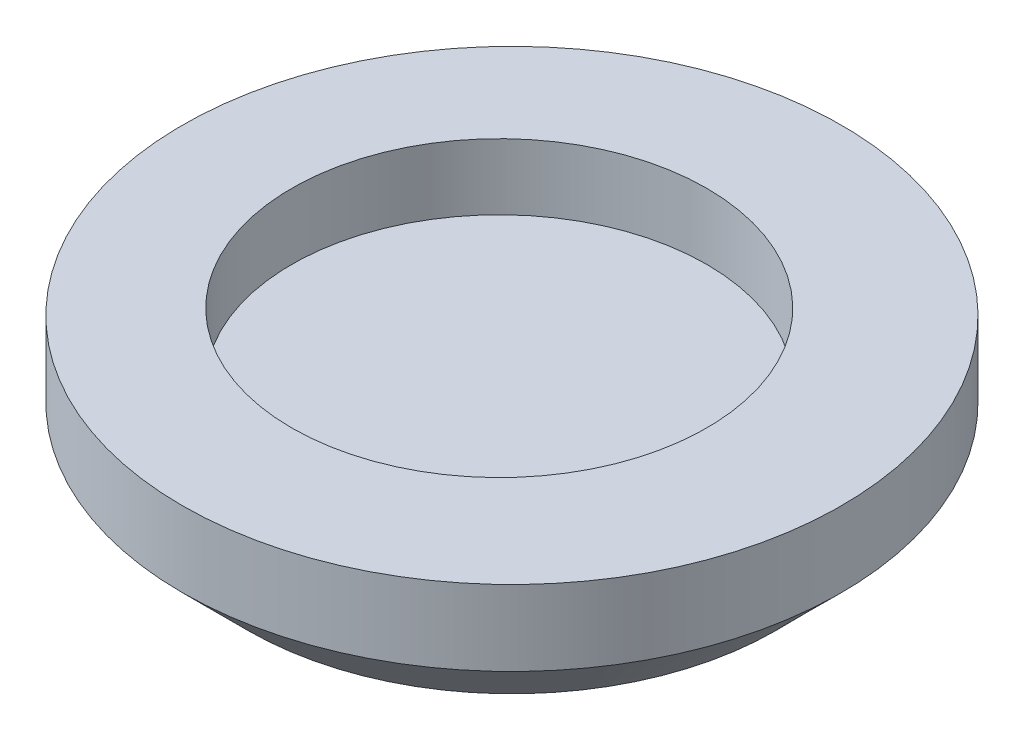
ISO-10303-21;
HEADER;
FILE_DESCRIPTION(('STEP AP214'),'2;1');
FILE_NAME('part.step','',(''),(''),'','','');
FILE_SCHEMA(('AUTOMOTIVE_DESIGN { 1 0 10303 214 1 1 1 1 }'));
ENDSEC;
DATA;
#1=APPLICATION_CONTEXT('core data for automotive mechanical design processes');
#2=APPLICATION_PROTOCOL_DEFINITION('international standard','automotive_design',2000,#1);
#3=PRODUCT_CONTEXT('',#1,'mechanical');
#4=PRODUCT('Part','Part','',(#3));
#5=PRODUCT_RELATED_PRODUCT_CATEGORY('part','',(#4));
#6=PRODUCT_DEFINITION_FORMATION('','',#4);
#7=PRODUCT_DEFINITION_CONTEXT('part definition',#1,'design');
#8=PRODUCT_DEFINITION('design','',#6,#7);
#9=PRODUCT_DEFINITION_SHAPE('','',#8);
#10=(LENGTH_UNIT() NAMED_UNIT(*) SI_UNIT(.MILLI.,.METRE.));
#11=(NAMED_UNIT(*) PLANE_ANGLE_UNIT() SI_UNIT($,.RADIAN.));
#12=(NAMED_UNIT(*) SI_UNIT($,.STERADIAN.) SOLID_ANGLE_UNIT());
#13=UNCERTAINTY_MEASURE_WITH_UNIT(LENGTH_MEASURE(1.E-05),#10,'distance_accuracy_value','');
#14=(GEOMETRIC_REPRESENTATION_CONTEXT(3) GLOBAL_UNCERTAINTY_ASSIGNED_CONTEXT((#13)) GLOBAL_UNIT_ASSIGNED_CONTEXT((#10,
#11,#12)) REPRESENTATION_CONTEXT('',''));
#15=CARTESIAN_POINT('',(0.,0.,0.));
#16=DIRECTION('',(0.,0.,1.));
#17=DIRECTION('',(1.,0.,0.));
#18=AXIS2_PLACEMENT_3D('',#15,#16,#17);
#19=CARTESIAN_POINT('',(1.34573887151634,15.,0.));
#20=DIRECTION('',(0.,-1.,0.));
#21=DIRECTION('',(0.,0.,-1.));
#22=AXIS2_PLACEMENT_3D('',#19,#20,#21);
#23=CYLINDRICAL_SURFACE('',#22,35.);
#24=CARTESIAN_POINT('',(1.34573887151634,7.00000000000001,0.));
#25=DIRECTION('',(0.,1.,0.));
#26=DIRECTION('',(0.,0.,1.));
#27=AXIS2_PLACEMENT_3D('',#24,#25,#26);
#28=CIRCLE('',#27,35.);
#29=CARTESIAN_POINT('',(1.34573887151634,7.00000000000001,35.));
#30=VERTEX_POINT('',#29);
#31=EDGE_CURVE('E47',#30,#30,#28,.T.);
#32=ORIENTED_EDGE('',*,*,#31,.T.);
#33=EDGE_LOOP('',(#32));
#34=FACE_BOUND('',#33,.T.);
#35=CARTESIAN_POINT('',(1.34573887151634,15.,0.));
#36=DIRECTION('',(0.,1.,0.));
#37=DIRECTION('',(0.,0.,1.));
#38=AXIS2_PLACEMENT_3D('',#35,#36,#37);
#39=CIRCLE('',#38,35.);
#40=CARTESIAN_POINT('',(1.34573887151634,15.,35.));
#41=VERTEX_POINT('',#40);
#42=EDGE_CURVE('E52',#41,#41,#39,.T.);
#43=ORIENTED_EDGE('',*,*,#42,.F.);
#44=EDGE_LOOP('',(#43));
#45=FACE_BOUND('',#44,.T.);
#46=ADVANCED_FACE('F38',(#34,#45),#23,.T.);
#47=CARTESIAN_POINT('',(1.34573887151634,15.,0.));
#48=DIRECTION('',(0.,1.,0.));
#49=DIRECTION('',(0.,0.,1.));
#50=AXIS2_PLACEMENT_3D('',#47,#48,#49);
#51=PLANE('',#50);
#52=CARTESIAN_POINT('',(0.,15.,0.));
#53=DIRECTION('',(0.,1.,0.));
#54=DIRECTION('',(0.,0.,1.));
#55=AXIS2_PLACEMENT_3D('',#52,#53,#54);
#56=CIRCLE('',#55,22.0418809435667);
#57=CARTESIAN_POINT('',(0.,15.,22.0418809435667));
#58=VERTEX_POINT('',#57);
#59=EDGE_CURVE('E60',#58,#58,#56,.T.);
#60=ORIENTED_EDGE('',*,*,#59,.F.);
#61=EDGE_LOOP('',(#60));
#62=FACE_BOUND('',#61,.T.);
#63=ORIENTED_EDGE('',*,*,#42,.T.);
#64=EDGE_LOOP('',(#63));
#65=FACE_BOUND('',#64,.T.);
#66=ADVANCED_FACE('F76',(#62,#65),#51,.T.);
#67=CARTESIAN_POINT('',(1.34573887151634,0.,0.));
#68=DIRECTION('',(0.,1.,0.));
#69=DIRECTION('',(0.,0.,1.));
#70=AXIS2_PLACEMENT_3D('',#67,#68,#69);
#71=PLANE('',#70);
#72=CARTESIAN_POINT('',(1.34573887151634,0.,0.));
#73=DIRECTION('',(0.,1.,0.));
#74=DIRECTION('',(0.,0.,1.));
#75=AXIS2_PLACEMENT_3D('',#72,#73,#74);
#76=CIRCLE('',#75,28.);
#77=CARTESIAN_POINT('',(1.34573887151634,0.,28.));
#78=VERTEX_POINT('',#77);
#79=EDGE_CURVE('E10',#78,#78,#76,.F.);
#80=ORIENTED_EDGE('',*,*,#79,.T.);
#81=EDGE_LOOP('',(#80));
#82=FACE_BOUND('',#81,.T.);
#83=ADVANCED_FACE('F79',(#82),#71,.F.);
#84=CARTESIAN_POINT('',(1.34573887151634,7.00000000000001,0.));
#85=DIRECTION('',(0.,1.,0.));
#86=DIRECTION('',(0.,0.,1.));
#87=AXIS2_PLACEMENT_3D('',#84,#85,#86);
#88=CONICAL_SURFACE('',#87,35.,0.785398163397449);
#89=CARTESIAN_POINT('',(1.34573887151634,0.,28.));
#90=CARTESIAN_POINT('',(1.34573887151634,0.0729166666666651,28.0729166666667));
#91=CARTESIAN_POINT('',(1.34573887151634,0.145833333333332,28.1458333333333));
#92=CARTESIAN_POINT('',(1.34573887151634,0.291666666666667,28.2916666666667));
#93=CARTESIAN_POINT('',(1.34573887151634,0.364583333333334,28.3645833333333));
#94=CARTESIAN_POINT('',(1.34573887151634,0.510416666666667,28.5104166666667));
#95=CARTESIAN_POINT('',(1.34573887151634,0.583333333333333,28.5833333333333));
#96=CARTESIAN_POINT('',(1.34573887151634,0.729166666666667,28.7291666666667));
#97=CARTESIAN_POINT('',(1.34573887151634,0.802083333333334,28.8020833333333));
#98=CARTESIAN_POINT('',(1.34573887151634,0.947916666666668,28.9479166666667));
#99=CARTESIAN_POINT('',(1.34573887151634,1.02083333333333,29.0208333333333));
#100=CARTESIAN_POINT('',(1.34573887151634,1.16666666666667,29.1666666666667));
#101=CARTESIAN_POINT('',(1.34573887151634,1.23958333333334,29.2395833333333));
#102=CARTESIAN_POINT('',(1.34573887151634,1.38541666666667,29.3854166666667));
#103=CARTESIAN_POINT('',(1.34573887151634,1.45833333333334,29.4583333333333));
#104=CARTESIAN_POINT('',(1.34573887151634,1.60416666666667,29.6041666666667));
#105=CARTESIAN_POINT('',(1.34573887151634,1.67708333333334,29.6770833333333));
#106=CARTESIAN_POINT('',(1.34573887151634,1.82291666666667,29.8229166666667));
#107=CARTESIAN_POINT('',(1.34573887151634,1.89583333333334,29.8958333333333));
#108=CARTESIAN_POINT('',(1.34573887151634,2.04166666666667,30.0416666666667));
#109=CARTESIAN_POINT('',(1.34573887151634,2.11458333333334,30.1145833333333));
#110=CARTESIAN_POINT('',(1.34573887151634,2.26041666666667,30.2604166666667));
#111=CARTESIAN_POINT('',(1.34573887151634,2.33333333333334,30.3333333333333));
#112=CARTESIAN_POINT('',(1.34573887151634,2.47916666666667,30.4791666666667));
#113=CARTESIAN_POINT('',(1.34573887151634,2.55208333333334,30.5520833333333));
#114=CARTESIAN_POINT('',(1.34573887151634,2.69791666666667,30.6979166666667));
#115=CARTESIAN_POINT('',(1.34573887151634,2.77083333333334,30.7708333333333));
#116=CARTESIAN_POINT('',(1.34573887151634,2.91666666666667,30.9166666666667));
#117=CARTESIAN_POINT('',(1.34573887151634,2.98958333333334,30.9895833333333));
#118=CARTESIAN_POINT('',(1.34573887151634,3.13541666666667,31.1354166666667));
#119=CARTESIAN_POINT('',(1.34573887151634,3.20833333333334,31.2083333333333));
#120=CARTESIAN_POINT('',(1.34573887151634,3.35416666666667,31.3541666666667));
#121=CARTESIAN_POINT('',(1.34573887151634,3.42708333333334,31.4270833333333));
#122=CARTESIAN_POINT('',(1.34573887151634,3.57291666666667,31.5729166666667));
#123=CARTESIAN_POINT('',(1.34573887151634,3.64583333333334,31.6458333333333));
#124=CARTESIAN_POINT('',(1.34573887151634,3.79166666666667,31.7916666666667));
#125=CARTESIAN_POINT('',(1.34573887151634,3.86458333333334,31.8645833333333));
#126=CARTESIAN_POINT('',(1.34573887151634,4.01041666666667,32.0104166666667));
#127=CARTESIAN_POINT('',(1.34573887151634,4.08333333333334,32.0833333333333));
#128=CARTESIAN_POINT('',(1.34573887151634,4.22916666666667,32.2291666666667));
#129=CARTESIAN_POINT('',(1.34573887151634,4.30208333333334,32.3020833333333));
#130=CARTESIAN_POINT('',(1.34573887151634,4.44791666666667,32.4479166666667));
#131=CARTESIAN_POINT('',(1.34573887151634,4.52083333333334,32.5208333333333));
#132=CARTESIAN_POINT('',(1.34573887151634,4.66666666666667,32.6666666666667));
#133=CARTESIAN_POINT('',(1.34573887151634,4.73958333333334,32.7395833333333));
#134=CARTESIAN_POINT('',(1.34573887151634,4.88541666666667,32.8854166666667));
#135=CARTESIAN_POINT('',(1.34573887151634,4.95833333333334,32.9583333333333));
#136=CARTESIAN_POINT('',(1.34573887151634,5.10416666666668,33.1041666666667));
#137=CARTESIAN_POINT('',(1.34573887151634,5.17708333333334,33.1770833333333));
#138=CARTESIAN_POINT('',(1.34573887151634,5.32291666666668,33.3229166666667));
#139=CARTESIAN_POINT('',(1.34573887151634,5.39583333333334,33.3958333333333));
#140=CARTESIAN_POINT('',(1.34573887151634,5.54166666666668,33.5416666666667));
#141=CARTESIAN_POINT('',(1.34573887151634,5.61458333333334,33.6145833333333));
#142=CARTESIAN_POINT('',(1.34573887151634,5.76041666666668,33.7604166666667));
#143=CARTESIAN_POINT('',(1.34573887151634,5.83333333333334,33.8333333333333));
#144=CARTESIAN_POINT('',(1.34573887151634,5.97916666666668,33.9791666666667));
#145=CARTESIAN_POINT('',(1.34573887151634,6.05208333333334,34.0520833333333));
#146=CARTESIAN_POINT('',(1.34573887151634,6.19791666666668,34.1979166666667));
#147=CARTESIAN_POINT('',(1.34573887151634,6.27083333333334,34.2708333333333));
#148=CARTESIAN_POINT('',(1.34573887151634,6.41666666666668,34.4166666666667));
#149=CARTESIAN_POINT('',(1.34573887151634,6.48958333333334,34.4895833333333));
#150=CARTESIAN_POINT('',(1.34573887151634,6.63541666666668,34.6354166666667));
#151=CARTESIAN_POINT('',(1.34573887151634,6.70833333333334,34.7083333333333));
#152=CARTESIAN_POINT('',(1.34573887151634,6.85416666666668,34.8541666666667));
#153=CARTESIAN_POINT('',(1.34573887151634,6.92708333333335,34.9270833333333));
#154=CARTESIAN_POINT('',(1.34573887151634,7.00000000000001,35.));
#155=B_SPLINE_CURVE_WITH_KNOTS('',3,(#89,#90,#91,#92,#93,#94,#95,#96,#97,#98,#99,#100,#101,#102,
#103,#104,#105,#106,#107,#108,#109,#110,#111,#112,#113,#114,#115,#116,#117,#118,#119,#120,#121,
#122,#123,#124,#125,#126,#127,#128,#129,#130,#131,#132,#133,#134,#135,#136,#137,#138,#139,#140,
#141,#142,#143,#144,#145,#146,#147,#148,#149,#150,#151,#152,#153,#154),.UNSPECIFIED.,.F.,.F.,(4,
2,2,2,2,2,2,2,2,2,2,2,2,2,2,2,2,2,2,2,2,2,2,2,2,2,2,2,2,2,2,2,4),(0.,0.309359216769115,
0.61871843353823,0.928077650307347,1.23743686707646,1.54679608384558,1.85615530061469,
2.16551451738381,2.47487373415292,2.78423295092204,3.09359216769115,3.40295138446027,
3.71231060122938,4.0216698179985,4.33102903476762,4.64038825153673,4.94974746830584,
5.25910668507496,5.56846590184408,5.87782511861319,6.18718433538231,6.49654355215142,
6.80590276892054,7.11526198568965,7.42462120245877,7.73398041922789,8.043339635997,
8.35269885276612,8.66205806953523,8.97141728630435,9.28077650307346,9.59013571984257,
9.89949493661169),.UNSPECIFIED.);
#156=EDGE_CURVE('BSEAM41',#78,#30,#155,.T.);
#157=ORIENTED_EDGE('',*,*,#79,.F.);
#158=ORIENTED_EDGE('',*,*,#31,.F.);
#159=ORIENTED_EDGE('',*,*,#156,.T.);
#160=ORIENTED_EDGE('',*,*,#156,.F.);
#161=EDGE_LOOP('',(#157,#159,#158,#160));
#162=FACE_BOUND('',#161,.T.);
#163=ADVANCED_FACE('F41',(#162),#88,.T.);
#164=CARTESIAN_POINT('',(0.,8.,0.));
#165=DIRECTION('',(0.,1.,0.));
#166=DIRECTION('',(0.,0.,1.));
#167=AXIS2_PLACEMENT_3D('',#164,#165,#166);
#168=CYLINDRICAL_SURFACE('',#167,22.0418809435667);
#169=CARTESIAN_POINT('',(0.,8.,0.));
#170=DIRECTION('',(0.,1.,0.));
#171=DIRECTION('',(0.,0.,1.));
#172=AXIS2_PLACEMENT_3D('',#169,#170,#171);
#173=CIRCLE('',#172,22.0418809435667);
#174=CARTESIAN_POINT('',(0.,8.,22.0418809435667));
#175=VERTEX_POINT('',#174);
#176=EDGE_CURVE('E57',#175,#175,#173,.T.);
#177=ORIENTED_EDGE('',*,*,#176,.F.);
#178=EDGE_LOOP('',(#177));
#179=FACE_BOUND('',#178,.T.);
#180=ORIENTED_EDGE('',*,*,#59,.T.);
#181=EDGE_LOOP('',(#180));
#182=FACE_BOUND('',#181,.T.);
#183=ADVANCED_FACE('F70',(#179,#182),#168,.F.);
#184=CARTESIAN_POINT('',(0.,8.,0.));
#185=DIRECTION('',(0.,1.,0.));
#186=DIRECTION('',(0.,0.,1.));
#187=AXIS2_PLACEMENT_3D('',#184,#185,#186);
#188=PLANE('',#187);
#189=ORIENTED_EDGE('',*,*,#176,.T.);
#190=EDGE_LOOP('',(#189));
#191=FACE_BOUND('',#190,.T.);
#192=ADVANCED_FACE('F68',(#191),#188,.T.);
#193=CLOSED_SHELL('',(#46,#66,#83,#163,#183,#192));
#194=MANIFOLD_SOLID_BREP('B2',#193);
#195=ADVANCED_BREP_SHAPE_REPRESENTATION('',(#18,#194),#14);
#196=SHAPE_DEFINITION_REPRESENTATION(#9,#195);
ENDSEC;
END-ISO-10303-21;
